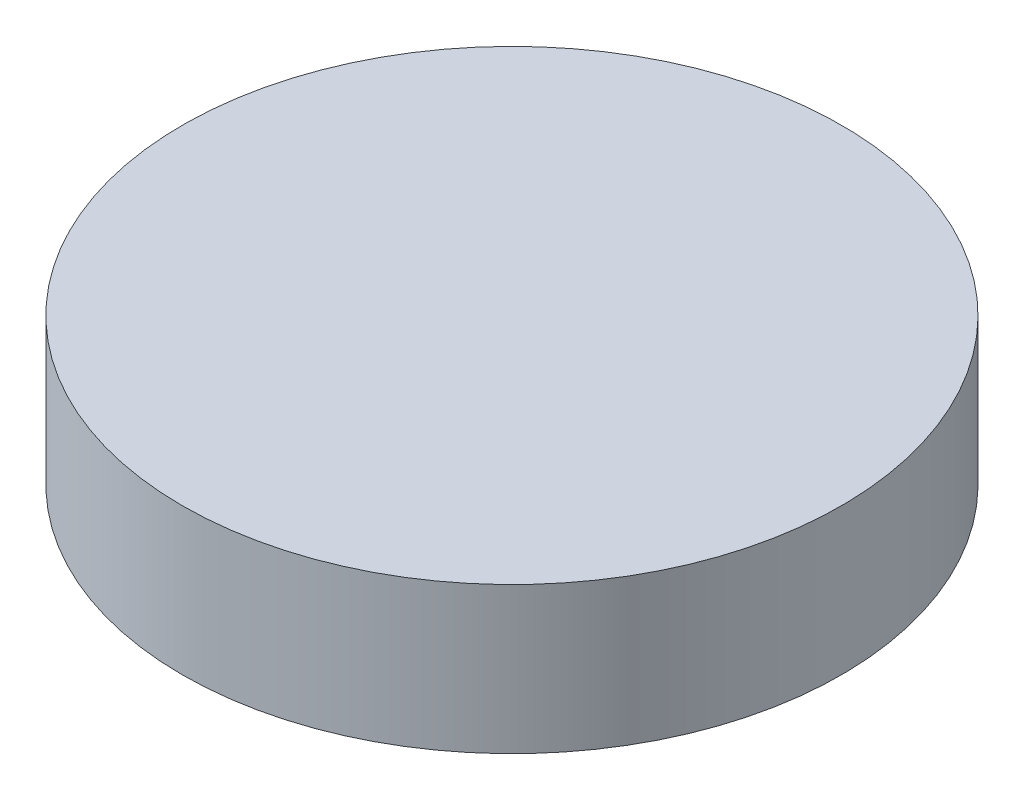
ISO-10303-21;
HEADER;
FILE_DESCRIPTION(('STEP AP214'),'2;1');
FILE_NAME('part.step','',(''),(''),'','','');
FILE_SCHEMA(('AUTOMOTIVE_DESIGN { 1 0 10303 214 1 1 1 1 }'));
ENDSEC;
DATA;
#1=APPLICATION_CONTEXT('core data for automotive mechanical design processes');
#2=APPLICATION_PROTOCOL_DEFINITION('international standard','automotive_design',2000,#1);
#3=PRODUCT_CONTEXT('',#1,'mechanical');
#4=PRODUCT('Part','Part','',(#3));
#5=PRODUCT_RELATED_PRODUCT_CATEGORY('part','',(#4));
#6=PRODUCT_DEFINITION_FORMATION('','',#4);
#7=PRODUCT_DEFINITION_CONTEXT('part definition',#1,'design');
#8=PRODUCT_DEFINITION('design','',#6,#7);
#9=PRODUCT_DEFINITION_SHAPE('','',#8);
#10=(LENGTH_UNIT() NAMED_UNIT(*) SI_UNIT(.MILLI.,.METRE.));
#11=(NAMED_UNIT(*) PLANE_ANGLE_UNIT() SI_UNIT($,.RADIAN.));
#12=(NAMED_UNIT(*) SI_UNIT($,.STERADIAN.) SOLID_ANGLE_UNIT());
#13=UNCERTAINTY_MEASURE_WITH_UNIT(LENGTH_MEASURE(1.E-05),#10,'distance_accuracy_value','');
#14=(GEOMETRIC_REPRESENTATION_CONTEXT(3) GLOBAL_UNCERTAINTY_ASSIGNED_CONTEXT((#13)) GLOBAL_UNIT_ASSIGNED_CONTEXT((#10,
#11,#12)) REPRESENTATION_CONTEXT('',''));
#15=CARTESIAN_POINT('',(0.,0.,0.));
#16=DIRECTION('',(0.,0.,1.));
#17=DIRECTION('',(1.,0.,0.));
#18=AXIS2_PLACEMENT_3D('',#15,#16,#17);
#19=CARTESIAN_POINT('',(0.,400.,0.));
#20=DIRECTION('',(0.,-1.,0.));
#21=DIRECTION('',(0.,0.,-1.));
#22=AXIS2_PLACEMENT_3D('',#19,#20,#21);
#23=CYLINDRICAL_SURFACE('',#22,900.);
#24=CARTESIAN_POINT('',(0.,400.,0.));
#25=DIRECTION('',(0.,1.,0.));
#26=DIRECTION('',(0.,0.,1.));
#27=AXIS2_PLACEMENT_3D('',#24,#25,#26);
#28=CIRCLE('',#27,900.);
#29=CARTESIAN_POINT('',(0.,400.,900.));
#30=VERTEX_POINT('',#29);
#31=EDGE_CURVE('E53',#30,#30,#28,.T.);
#32=ORIENTED_EDGE('',*,*,#31,.F.);
#33=EDGE_LOOP('',(#32));
#34=FACE_BOUND('',#33,.T.);
#35=CARTESIAN_POINT('',(0.,0.,0.));
#36=DIRECTION('',(0.,1.,0.));
#37=DIRECTION('',(0.,0.,1.));
#38=AXIS2_PLACEMENT_3D('',#35,#36,#37);
#39=CIRCLE('',#38,900.);
#40=CARTESIAN_POINT('',(0.,0.,900.));
#41=VERTEX_POINT('',#40);
#42=EDGE_CURVE('E42',#41,#41,#39,.T.);
#43=ORIENTED_EDGE('',*,*,#42,.T.);
#44=EDGE_LOOP('',(#43));
#45=FACE_BOUND('',#44,.T.);
#46=ADVANCED_FACE('F39',(#34,#45),#23,.T.);
#47=CARTESIAN_POINT('',(0.,400.,0.));
#48=DIRECTION('',(0.,1.,0.));
#49=DIRECTION('',(0.,0.,1.));
#50=AXIS2_PLACEMENT_3D('',#47,#48,#49);
#51=PLANE('',#50);
#52=ORIENTED_EDGE('',*,*,#31,.T.);
#53=EDGE_LOOP('',(#52));
#54=FACE_BOUND('',#53,.T.);
#55=ADVANCED_FACE('F73',(#54),#51,.T.);
#56=CARTESIAN_POINT('',(0.,0.,0.));
#57=DIRECTION('',(0.,1.,0.));
#58=DIRECTION('',(0.,0.,1.));
#59=AXIS2_PLACEMENT_3D('',#56,#57,#58);
#60=PLANE('',#59);
#61=CARTESIAN_POINT('',(0.,0.,0.));
#62=DIRECTION('',(0.,-1.,0.));
#63=DIRECTION('',(0.,0.,-1.));
#64=AXIS2_PLACEMENT_3D('',#61,#62,#63);
#65=CIRCLE('',#64,250.);
#66=CARTESIAN_POINT('',(0.,0.,-250.));
#67=VERTEX_POINT('',#66);
#68=EDGE_CURVE('E47',#67,#67,#65,.T.);
#69=ORIENTED_EDGE('',*,*,#68,.F.);
#70=EDGE_LOOP('',(#69));
#71=FACE_BOUND('',#70,.T.);
#72=ORIENTED_EDGE('',*,*,#42,.F.);
#73=EDGE_LOOP('',(#72));
#74=FACE_BOUND('',#73,.T.);
#75=ADVANCED_FACE('F70',(#71,#74),#60,.F.);
#76=CARTESIAN_POINT('',(0.,-50.,0.));
#77=DIRECTION('',(0.,1.,0.));
#78=DIRECTION('',(0.,0.,1.));
#79=AXIS2_PLACEMENT_3D('',#76,#77,#78);
#80=CYLINDRICAL_SURFACE('',#79,250.);
#81=CARTESIAN_POINT('',(0.,-50.,0.));
#82=DIRECTION('',(0.,-1.,0.));
#83=DIRECTION('',(0.,0.,-1.));
#84=AXIS2_PLACEMENT_3D('',#81,#82,#83);
#85=CIRCLE('',#84,250.);
#86=CARTESIAN_POINT('',(0.,-50.,-250.));
#87=VERTEX_POINT('',#86);
#88=EDGE_CURVE('E58',#87,#87,#85,.T.);
#89=ORIENTED_EDGE('',*,*,#88,.F.);
#90=EDGE_LOOP('',(#89));
#91=FACE_BOUND('',#90,.T.);
#92=ORIENTED_EDGE('',*,*,#68,.T.);
#93=EDGE_LOOP('',(#92));
#94=FACE_BOUND('',#93,.T.);
#95=ADVANCED_FACE('F72',(#91,#94),#80,.T.);
#96=CARTESIAN_POINT('',(0.,-50.,0.));
#97=DIRECTION('',(0.,-1.,0.));
#98=DIRECTION('',(0.,0.,-1.));
#99=AXIS2_PLACEMENT_3D('',#96,#97,#98);
#100=PLANE('',#99);
#101=CARTESIAN_POINT('',(0.,-50.,0.));
#102=DIRECTION('',(0.,-1.,0.));
#103=DIRECTION('',(0.,0.,-1.));
#104=AXIS2_PLACEMENT_3D('',#101,#102,#103);
#105=CIRCLE('',#104,200.);
#106=CARTESIAN_POINT('',(0.,-50.,-200.));
#107=VERTEX_POINT('',#106);
#108=EDGE_CURVE('E10',#107,#107,#105,.T.);
#109=ORIENTED_EDGE('',*,*,#108,.F.);
#110=EDGE_LOOP('',(#109));
#111=FACE_BOUND('',#110,.T.);
#112=ORIENTED_EDGE('',*,*,#88,.T.);
#113=EDGE_LOOP('',(#112));
#114=FACE_BOUND('',#113,.T.);
#115=ADVANCED_FACE('F79',(#111,#114),#100,.T.);
#116=CARTESIAN_POINT('',(0.,-450.,0.));
#117=DIRECTION('',(0.,1.,0.));
#118=DIRECTION('',(0.,0.,1.));
#119=AXIS2_PLACEMENT_3D('',#116,#117,#118);
#120=CYLINDRICAL_SURFACE('',#119,200.);
#121=CARTESIAN_POINT('',(0.,-450.,0.));
#122=DIRECTION('',(0.,-1.,0.));
#123=DIRECTION('',(0.,0.,-1.));
#124=AXIS2_PLACEMENT_3D('',#121,#122,#123);
#125=CIRCLE('',#124,200.);
#126=CARTESIAN_POINT('',(0.,-450.,-200.));
#127=VERTEX_POINT('',#126);
#128=EDGE_CURVE('E57',#127,#127,#125,.T.);
#129=ORIENTED_EDGE('',*,*,#128,.F.);
#130=EDGE_LOOP('',(#129));
#131=FACE_BOUND('',#130,.T.);
#132=ORIENTED_EDGE('',*,*,#108,.T.);
#133=EDGE_LOOP('',(#132));
#134=FACE_BOUND('',#133,.T.);
#135=ADVANCED_FACE('F106',(#131,#134),#120,.T.);
#136=CARTESIAN_POINT('',(0.,-450.,0.));
#137=DIRECTION('',(0.,-1.,0.));
#138=DIRECTION('',(0.,0.,-1.));
#139=AXIS2_PLACEMENT_3D('',#136,#137,#138);
#140=PLANE('',#139);
#141=ORIENTED_EDGE('',*,*,#128,.T.);
#142=EDGE_LOOP('',(#141));
#143=FACE_BOUND('',#142,.T.);
#144=ADVANCED_FACE('F115',(#143),#140,.T.);
#145=CLOSED_SHELL('',(#46,#55,#75,#95,#115,#135,#144));
#146=MANIFOLD_SOLID_BREP('B2',#145);
#147=ADVANCED_BREP_SHAPE_REPRESENTATION('',(#18,#146),#14);
#148=SHAPE_DEFINITION_REPRESENTATION(#9,#147);
ENDSEC;
END-ISO-10303-21;
